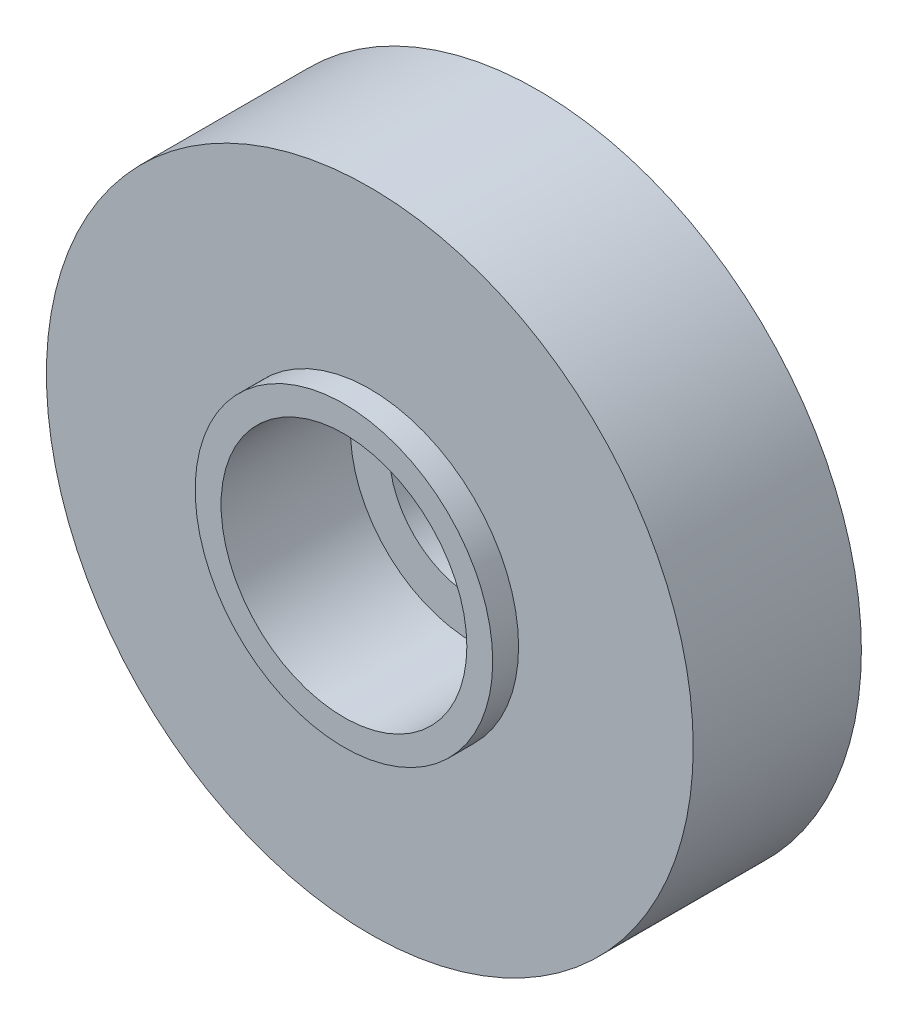
ISO-10303-21;
HEADER;
FILE_DESCRIPTION(('STEP AP214'),'2;1');
FILE_NAME('part.step','',(''),(''),'','','');
FILE_SCHEMA(('AUTOMOTIVE_DESIGN { 1 0 10303 214 1 1 1 1 }'));
ENDSEC;
DATA;
#1=APPLICATION_CONTEXT('core data for automotive mechanical design processes');
#2=APPLICATION_PROTOCOL_DEFINITION('international standard','automotive_design',2000,#1);
#3=PRODUCT_CONTEXT('',#1,'mechanical');
#4=PRODUCT('Part','Part','',(#3));
#5=PRODUCT_RELATED_PRODUCT_CATEGORY('part','',(#4));
#6=PRODUCT_DEFINITION_FORMATION('','',#4);
#7=PRODUCT_DEFINITION_CONTEXT('part definition',#1,'design');
#8=PRODUCT_DEFINITION('design','',#6,#7);
#9=PRODUCT_DEFINITION_SHAPE('','',#8);
#10=(LENGTH_UNIT() NAMED_UNIT(*) SI_UNIT(.MILLI.,.METRE.));
#11=(NAMED_UNIT(*) PLANE_ANGLE_UNIT() SI_UNIT($,.RADIAN.));
#12=(NAMED_UNIT(*) SI_UNIT($,.STERADIAN.) SOLID_ANGLE_UNIT());
#13=UNCERTAINTY_MEASURE_WITH_UNIT(LENGTH_MEASURE(1.E-05),#10,'distance_accuracy_value','');
#14=(GEOMETRIC_REPRESENTATION_CONTEXT(3) GLOBAL_UNCERTAINTY_ASSIGNED_CONTEXT((#13)) GLOBAL_UNIT_ASSIGNED_CONTEXT((#10,
#11,#12)) REPRESENTATION_CONTEXT('',''));
#15=CARTESIAN_POINT('',(0.,0.,0.));
#16=DIRECTION('',(0.,0.,1.));
#17=DIRECTION('',(1.,0.,0.));
#18=AXIS2_PLACEMENT_3D('',#15,#16,#17);
#19=CARTESIAN_POINT('',(0.,0.,0.));
#20=DIRECTION('',(0.,0.,1.));
#21=DIRECTION('',(1.,0.,0.));
#22=AXIS2_PLACEMENT_3D('',#19,#20,#21);
#23=PLANE('',#22);
#24=CARTESIAN_POINT('',(0.,0.,0.));
#25=DIRECTION('',(0.,0.,1.));
#26=DIRECTION('',(1.,0.,0.));
#27=AXIS2_PLACEMENT_3D('',#24,#25,#26);
#28=CIRCLE('',#27,25.);
#29=CARTESIAN_POINT('',(25.,0.,0.));
#30=VERTEX_POINT('',#29);
#31=EDGE_CURVE('E34',#30,#30,#28,.T.);
#32=ORIENTED_EDGE('',*,*,#31,.T.);
#33=EDGE_LOOP('',(#32));
#34=FACE_BOUND('',#33,.T.);
#35=CARTESIAN_POINT('',(0.,0.,0.));
#36=DIRECTION('',(0.,0.,1.));
#37=DIRECTION('',(1.,0.,0.));
#38=AXIS2_PLACEMENT_3D('',#35,#36,#37);
#39=CIRCLE('',#38,11.5);
#40=CARTESIAN_POINT('',(11.5,0.,0.));
#41=VERTEX_POINT('',#40);
#42=EDGE_CURVE('E43',#41,#41,#39,.T.);
#43=ORIENTED_EDGE('',*,*,#42,.F.);
#44=EDGE_LOOP('',(#43));
#45=FACE_BOUND('',#44,.T.);
#46=ADVANCED_FACE('F30',(#34,#45),#23,.T.);
#47=CARTESIAN_POINT('',(0.,0.,-13.));
#48=DIRECTION('',(0.,0.,1.));
#49=DIRECTION('',(1.,0.,0.));
#50=AXIS2_PLACEMENT_3D('',#47,#48,#49);
#51=CYLINDRICAL_SURFACE('',#50,25.);
#52=CARTESIAN_POINT('',(0.,0.,-13.));
#53=DIRECTION('',(0.,0.,1.));
#54=DIRECTION('',(1.,0.,0.));
#55=AXIS2_PLACEMENT_3D('',#52,#53,#54);
#56=CIRCLE('',#55,25.);
#57=CARTESIAN_POINT('',(25.,0.,-13.));
#58=VERTEX_POINT('',#57);
#59=EDGE_CURVE('E10',#58,#58,#56,.T.);
#60=CARTESIAN_POINT('',(25.,0.,-13.));
#61=CARTESIAN_POINT('',(25.,0.,-12.8645833333333));
#62=CARTESIAN_POINT('',(25.,0.,-12.7291666666667));
#63=CARTESIAN_POINT('',(25.,0.,-12.4583333333333));
#64=CARTESIAN_POINT('',(25.,0.,-12.3229166666667));
#65=CARTESIAN_POINT('',(25.,0.,-12.0520833333333));
#66=CARTESIAN_POINT('',(25.,0.,-11.9166666666667));
#67=CARTESIAN_POINT('',(25.,0.,-11.6458333333333));
#68=CARTESIAN_POINT('',(25.,0.,-11.5104166666667));
#69=CARTESIAN_POINT('',(25.,0.,-11.2395833333333));
#70=CARTESIAN_POINT('',(25.,0.,-11.1041666666667));
#71=CARTESIAN_POINT('',(25.,0.,-10.8333333333333));
#72=CARTESIAN_POINT('',(25.,0.,-10.6979166666667));
#73=CARTESIAN_POINT('',(25.,0.,-10.4270833333333));
#74=CARTESIAN_POINT('',(25.,0.,-10.2916666666667));
#75=CARTESIAN_POINT('',(25.,0.,-10.0208333333333));
#76=CARTESIAN_POINT('',(25.,0.,-9.88541666666667));
#77=CARTESIAN_POINT('',(25.,0.,-9.61458333333333));
#78=CARTESIAN_POINT('',(25.,0.,-9.47916666666667));
#79=CARTESIAN_POINT('',(25.,0.,-9.20833333333333));
#80=CARTESIAN_POINT('',(25.,0.,-9.07291666666667));
#81=CARTESIAN_POINT('',(25.,0.,-8.80208333333333));
#82=CARTESIAN_POINT('',(25.,0.,-8.66666666666667));
#83=CARTESIAN_POINT('',(25.,0.,-8.39583333333333));
#84=CARTESIAN_POINT('',(25.,0.,-8.26041666666667));
#85=CARTESIAN_POINT('',(25.,0.,-7.98958333333333));
#86=CARTESIAN_POINT('',(25.,0.,-7.85416666666667));
#87=CARTESIAN_POINT('',(25.,0.,-7.58333333333333));
#88=CARTESIAN_POINT('',(25.,0.,-7.44791666666667));
#89=CARTESIAN_POINT('',(25.,0.,-7.17708333333333));
#90=CARTESIAN_POINT('',(25.,0.,-7.04166666666667));
#91=CARTESIAN_POINT('',(25.,0.,-6.77083333333333));
#92=CARTESIAN_POINT('',(25.,0.,-6.63541666666667));
#93=CARTESIAN_POINT('',(25.,0.,-6.36458333333333));
#94=CARTESIAN_POINT('',(25.,0.,-6.22916666666667));
#95=CARTESIAN_POINT('',(25.,0.,-5.95833333333333));
#96=CARTESIAN_POINT('',(25.,0.,-5.82291666666667));
#97=CARTESIAN_POINT('',(25.,0.,-5.55208333333333));
#98=CARTESIAN_POINT('',(25.,0.,-5.41666666666667));
#99=CARTESIAN_POINT('',(25.,0.,-5.14583333333333));
#100=CARTESIAN_POINT('',(25.,0.,-5.01041666666667));
#101=CARTESIAN_POINT('',(25.,0.,-4.73958333333333));
#102=CARTESIAN_POINT('',(25.,0.,-4.60416666666667));
#103=CARTESIAN_POINT('',(25.,0.,-4.33333333333333));
#104=CARTESIAN_POINT('',(25.,0.,-4.19791666666667));
#105=CARTESIAN_POINT('',(25.,0.,-3.92708333333333));
#106=CARTESIAN_POINT('',(25.,0.,-3.79166666666667));
#107=CARTESIAN_POINT('',(25.,0.,-3.52083333333333));
#108=CARTESIAN_POINT('',(25.,0.,-3.38541666666667));
#109=CARTESIAN_POINT('',(25.,0.,-3.11458333333333));
#110=CARTESIAN_POINT('',(25.,0.,-2.97916666666667));
#111=CARTESIAN_POINT('',(25.,0.,-2.70833333333333));
#112=CARTESIAN_POINT('',(25.,0.,-2.57291666666667));
#113=CARTESIAN_POINT('',(25.,0.,-2.30208333333333));
#114=CARTESIAN_POINT('',(25.,0.,-2.16666666666667));
#115=CARTESIAN_POINT('',(25.,0.,-1.89583333333333));
#116=CARTESIAN_POINT('',(25.,0.,-1.76041666666667));
#117=CARTESIAN_POINT('',(25.,0.,-1.48958333333333));
#118=CARTESIAN_POINT('',(25.,0.,-1.35416666666667));
#119=CARTESIAN_POINT('',(25.,0.,-1.08333333333333));
#120=CARTESIAN_POINT('',(25.,0.,-0.947916666666667));
#121=CARTESIAN_POINT('',(25.,0.,-0.677083333333334));
#122=CARTESIAN_POINT('',(25.,0.,-0.541666666666667));
#123=CARTESIAN_POINT('',(25.,0.,-0.270833333333334));
#124=CARTESIAN_POINT('',(25.,0.,-0.135416666666667));
#125=CARTESIAN_POINT('',(25.,0.,0.));
#126=B_SPLINE_CURVE_WITH_KNOTS('',3,(#60,#61,#62,#63,#64,#65,#66,#67,#68,#69,#70,#71,#72,#73,
#74,#75,#76,#77,#78,#79,#80,#81,#82,#83,#84,#85,#86,#87,#88,#89,#90,#91,#92,#93,#94,#95,#96,#97,
#98,#99,#100,#101,#102,#103,#104,#105,#106,#107,#108,#109,#110,#111,#112,#113,#114,#115,#116,
#117,#118,#119,#120,#121,#122,#123,#124,#125),.UNSPECIFIED.,.F.,.F.,(4,2,2,2,2,2,2,2,2,2,2,2,2,
2,2,2,2,2,2,2,2,2,2,2,2,2,2,2,2,2,2,2,4),(0.,0.406249999999999,0.812499999999999,1.21875,1.625,
2.03125,2.4375,2.84375,3.25,3.65625,4.0625,4.46875,4.875,5.28125,5.6875,6.09375,6.5,6.90625,
7.3125,7.71875,8.125,8.53125,8.9375,9.34375,9.75,10.15625,10.5625,10.96875,11.375,11.78125,
12.1875,12.59375,13.),.UNSPECIFIED.);
#127=EDGE_CURVE('BSEAM32',#58,#30,#126,.T.);
#128=ORIENTED_EDGE('',*,*,#59,.T.);
#129=ORIENTED_EDGE('',*,*,#31,.F.);
#130=ORIENTED_EDGE('',*,*,#127,.T.);
#131=ORIENTED_EDGE('',*,*,#127,.F.);
#132=EDGE_LOOP('',(#128,#130,#129,#131));
#133=FACE_BOUND('',#132,.T.);
#134=ADVANCED_FACE('F32',(#133),#51,.T.);
#135=CARTESIAN_POINT('',(0.,0.,-13.));
#136=DIRECTION('',(0.,0.,1.));
#137=DIRECTION('',(1.,0.,0.));
#138=AXIS2_PLACEMENT_3D('',#135,#136,#137);
#139=PLANE('',#138);
#140=CARTESIAN_POINT('',(0.,0.,-13.));
#141=DIRECTION('',(0.,0.,1.));
#142=DIRECTION('',(1.,0.,0.));
#143=AXIS2_PLACEMENT_3D('',#140,#141,#142);
#144=CIRCLE('',#143,6.5);
#145=CARTESIAN_POINT('',(6.5,0.,-13.));
#146=VERTEX_POINT('',#145);
#147=EDGE_CURVE('E52',#146,#146,#144,.T.);
#148=ORIENTED_EDGE('',*,*,#147,.T.);
#149=EDGE_LOOP('',(#148));
#150=FACE_BOUND('',#149,.T.);
#151=ORIENTED_EDGE('',*,*,#59,.F.);
#152=EDGE_LOOP('',(#151));
#153=FACE_BOUND('',#152,.T.);
#154=ADVANCED_FACE('F61',(#150,#153),#139,.F.);
#155=CARTESIAN_POINT('',(0.,0.,2.));
#156=DIRECTION('',(0.,0.,-1.));
#157=DIRECTION('',(-1.,0.,0.));
#158=AXIS2_PLACEMENT_3D('',#155,#156,#157);
#159=CYLINDRICAL_SURFACE('',#158,11.5);
#160=CARTESIAN_POINT('',(0.,0.,2.));
#161=DIRECTION('',(0.,0.,1.));
#162=DIRECTION('',(1.,0.,0.));
#163=AXIS2_PLACEMENT_3D('',#160,#161,#162);
#164=CIRCLE('',#163,11.5);
#165=CARTESIAN_POINT('',(11.5,0.,2.));
#166=VERTEX_POINT('',#165);
#167=EDGE_CURVE('E41',#166,#166,#164,.T.);
#168=ORIENTED_EDGE('',*,*,#167,.F.);
#169=EDGE_LOOP('',(#168));
#170=FACE_BOUND('',#169,.T.);
#171=ORIENTED_EDGE('',*,*,#42,.T.);
#172=EDGE_LOOP('',(#171));
#173=FACE_BOUND('',#172,.T.);
#174=ADVANCED_FACE('F85',(#170,#173),#159,.T.);
#175=CARTESIAN_POINT('',(0.,0.,2.));
#176=DIRECTION('',(0.,0.,1.));
#177=DIRECTION('',(1.,0.,0.));
#178=AXIS2_PLACEMENT_3D('',#175,#176,#177);
#179=PLANE('',#178);
#180=CARTESIAN_POINT('',(0.,0.,2.));
#181=DIRECTION('',(0.,0.,1.));
#182=DIRECTION('',(1.,0.,0.));
#183=AXIS2_PLACEMENT_3D('',#180,#181,#182);
#184=CIRCLE('',#183,9.5);
#185=CARTESIAN_POINT('',(9.5,0.,2.));
#186=VERTEX_POINT('',#185);
#187=EDGE_CURVE('E49',#186,#186,#184,.T.);
#188=ORIENTED_EDGE('',*,*,#187,.F.);
#189=EDGE_LOOP('',(#188));
#190=FACE_BOUND('',#189,.T.);
#191=ORIENTED_EDGE('',*,*,#167,.T.);
#192=EDGE_LOOP('',(#191));
#193=FACE_BOUND('',#192,.T.);
#194=ADVANCED_FACE('F79',(#190,#193),#179,.T.);
#195=CARTESIAN_POINT('',(0.,0.,-8.));
#196=DIRECTION('',(0.,0.,1.));
#197=DIRECTION('',(1.,0.,0.));
#198=AXIS2_PLACEMENT_3D('',#195,#196,#197);
#199=CYLINDRICAL_SURFACE('',#198,9.5);
#200=CARTESIAN_POINT('',(0.,0.,-8.));
#201=DIRECTION('',(0.,0.,1.));
#202=DIRECTION('',(1.,0.,0.));
#203=AXIS2_PLACEMENT_3D('',#200,#201,#202);
#204=CIRCLE('',#203,9.5);
#205=CARTESIAN_POINT('',(9.5,0.,-8.));
#206=VERTEX_POINT('',#205);
#207=EDGE_CURVE('E46',#206,#206,#204,.T.);
#208=ORIENTED_EDGE('',*,*,#207,.F.);
#209=EDGE_LOOP('',(#208));
#210=FACE_BOUND('',#209,.T.);
#211=ORIENTED_EDGE('',*,*,#187,.T.);
#212=EDGE_LOOP('',(#211));
#213=FACE_BOUND('',#212,.T.);
#214=ADVANCED_FACE('F73',(#210,#213),#199,.F.);
#215=CARTESIAN_POINT('',(0.,0.,-8.));
#216=DIRECTION('',(0.,0.,1.));
#217=DIRECTION('',(1.,0.,0.));
#218=AXIS2_PLACEMENT_3D('',#215,#216,#217);
#219=PLANE('',#218);
#220=CARTESIAN_POINT('',(0.,0.,-8.));
#221=DIRECTION('',(0.,0.,1.));
#222=DIRECTION('',(1.,0.,0.));
#223=AXIS2_PLACEMENT_3D('',#220,#221,#222);
#224=CIRCLE('',#223,6.5);
#225=CARTESIAN_POINT('',(6.5,0.,-8.));
#226=VERTEX_POINT('',#225);
#227=EDGE_CURVE('E55',#226,#226,#224,.T.);
#228=ORIENTED_EDGE('',*,*,#227,.F.);
#229=EDGE_LOOP('',(#228));
#230=FACE_BOUND('',#229,.T.);
#231=ORIENTED_EDGE('',*,*,#207,.T.);
#232=EDGE_LOOP('',(#231));
#233=FACE_BOUND('',#232,.T.);
#234=ADVANCED_FACE('F67',(#230,#233),#219,.T.);
#235=CARTESIAN_POINT('',(0.,0.,-13.));
#236=DIRECTION('',(0.,0.,1.));
#237=DIRECTION('',(1.,0.,0.));
#238=AXIS2_PLACEMENT_3D('',#235,#236,#237);
#239=CYLINDRICAL_SURFACE('',#238,6.5);
#240=ORIENTED_EDGE('',*,*,#147,.F.);
#241=EDGE_LOOP('',(#240));
#242=FACE_BOUND('',#241,.T.);
#243=ORIENTED_EDGE('',*,*,#227,.T.);
#244=EDGE_LOOP('',(#243));
#245=FACE_BOUND('',#244,.T.);
#246=ADVANCED_FACE('F64',(#242,#245),#239,.F.);
#247=CLOSED_SHELL('',(#46,#134,#154,#174,#194,#214,#234,#246));
#248=MANIFOLD_SOLID_BREP('B2',#247);
#249=ADVANCED_BREP_SHAPE_REPRESENTATION('',(#18,#248),#14);
#250=SHAPE_DEFINITION_REPRESENTATION(#9,#249);
ENDSEC;
END-ISO-10303-21;
